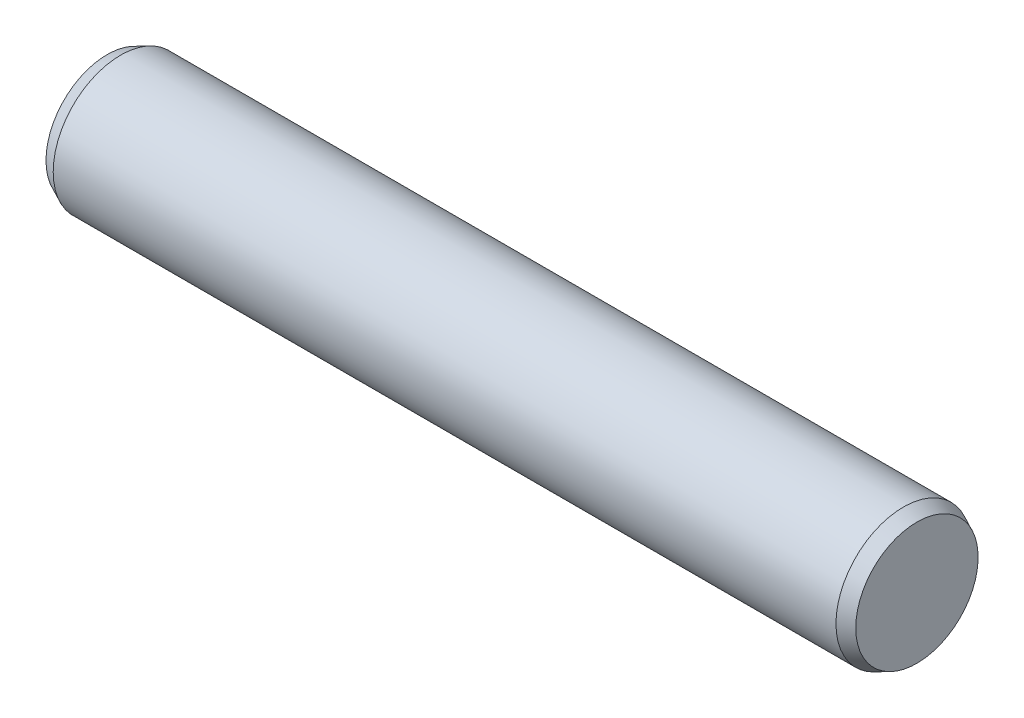
ISO-10303-21;
HEADER;
FILE_DESCRIPTION(('STEP AP214'),'2;1');
FILE_NAME('part.step','',(''),(''),'','','');
FILE_SCHEMA(('AUTOMOTIVE_DESIGN { 1 0 10303 214 1 1 1 1 }'));
ENDSEC;
DATA;
#1=APPLICATION_CONTEXT('core data for automotive mechanical design processes');
#2=APPLICATION_PROTOCOL_DEFINITION('international standard','automotive_design',2000,#1);
#3=PRODUCT_CONTEXT('',#1,'mechanical');
#4=PRODUCT('Part','Part','',(#3));
#5=PRODUCT_RELATED_PRODUCT_CATEGORY('part','',(#4));
#6=PRODUCT_DEFINITION_FORMATION('','',#4);
#7=PRODUCT_DEFINITION_CONTEXT('part definition',#1,'design');
#8=PRODUCT_DEFINITION('design','',#6,#7);
#9=PRODUCT_DEFINITION_SHAPE('','',#8);
#10=(LENGTH_UNIT() NAMED_UNIT(*) SI_UNIT(.MILLI.,.METRE.));
#11=(NAMED_UNIT(*) PLANE_ANGLE_UNIT() SI_UNIT($,.RADIAN.));
#12=(NAMED_UNIT(*) SI_UNIT($,.STERADIAN.) SOLID_ANGLE_UNIT());
#13=UNCERTAINTY_MEASURE_WITH_UNIT(LENGTH_MEASURE(1.E-05),#10,'distance_accuracy_value','');
#14=(GEOMETRIC_REPRESENTATION_CONTEXT(3) GLOBAL_UNCERTAINTY_ASSIGNED_CONTEXT((#13)) GLOBAL_UNIT_ASSIGNED_CONTEXT((#10,
#11,#12)) REPRESENTATION_CONTEXT('',''));
#15=CARTESIAN_POINT('',(0.,0.,0.));
#16=DIRECTION('',(0.,0.,1.));
#17=DIRECTION('',(1.,0.,0.));
#18=AXIS2_PLACEMENT_3D('',#15,#16,#17);
#19=CARTESIAN_POINT('',(0.,2.87889463707154,0.));
#20=DIRECTION('',(1.,0.,0.));
#21=DIRECTION('',(0.,0.,-1.));
#22=AXIS2_PLACEMENT_3D('',#19,#20,#21);
#23=PLANE('',#22);
#24=CARTESIAN_POINT('',(0.,0.,0.));
#25=DIRECTION('',(-1.,0.,0.));
#26=DIRECTION('',(0.,0.,1.));
#27=AXIS2_PLACEMENT_3D('',#24,#25,#26);
#28=CIRCLE('',#27,2.87889463707154);
#29=CARTESIAN_POINT('',(0.,0.,2.87889463707154));
#30=VERTEX_POINT('',#29);
#31=EDGE_CURVE('E44',#30,#30,#28,.T.);
#32=ORIENTED_EDGE('',*,*,#31,.T.);
#33=EDGE_LOOP('',(#32));
#34=FACE_BOUND('',#33,.T.);
#35=ADVANCED_FACE('F30',(#34),#23,.F.);
#36=CARTESIAN_POINT('',(38.1,0.,0.));
#37=DIRECTION('',(-1.,0.,0.));
#38=DIRECTION('',(0.,0.,1.));
#39=AXIS2_PLACEMENT_3D('',#36,#37,#38);
#40=PLANE('',#39);
#41=CARTESIAN_POINT('',(38.1,0.,0.));
#42=DIRECTION('',(-1.,0.,0.));
#43=DIRECTION('',(0.,0.,1.));
#44=AXIS2_PLACEMENT_3D('',#41,#42,#43);
#45=CIRCLE('',#44,2.87889463707155);
#46=CARTESIAN_POINT('',(38.1,0.,2.87889463707155));
#47=VERTEX_POINT('',#46);
#48=EDGE_CURVE('E10',#47,#47,#45,.T.);
#49=ORIENTED_EDGE('',*,*,#48,.F.);
#50=EDGE_LOOP('',(#49));
#51=FACE_BOUND('',#50,.T.);
#52=ADVANCED_FACE('F64',(#51),#40,.F.);
#53=CARTESIAN_POINT('',(38.1,0.,0.));
#54=DIRECTION('',(-1.,0.,0.));
#55=DIRECTION('',(0.,0.,1.));
#56=AXIS2_PLACEMENT_3D('',#53,#54,#55);
#57=CONICAL_SURFACE('',#56,2.87889463707155,0.436332312998584);
#58=CARTESIAN_POINT('',(37.465,0.,0.));
#59=DIRECTION('',(-1.,0.,0.));
#60=DIRECTION('',(0.,0.,1.));
#61=AXIS2_PLACEMENT_3D('',#58,#59,#60);
#62=CIRCLE('',#61,3.17499999999998);
#63=CARTESIAN_POINT('',(37.465,0.,3.17499999999998));
#64=VERTEX_POINT('',#63);
#65=EDGE_CURVE('E36',#64,#64,#62,.T.);
#66=ORIENTED_EDGE('',*,*,#65,.F.);
#67=EDGE_LOOP('',(#66));
#68=FACE_BOUND('',#67,.T.);
#69=ORIENTED_EDGE('',*,*,#48,.T.);
#70=EDGE_LOOP('',(#69));
#71=FACE_BOUND('',#70,.T.);
#72=ADVANCED_FACE('F59',(#68,#71),#57,.T.);
#73=CARTESIAN_POINT('',(-6.35,0.,0.));
#74=DIRECTION('',(-1.,0.,0.));
#75=DIRECTION('',(0.,0.,1.));
#76=AXIS2_PLACEMENT_3D('',#73,#74,#75);
#77=CYLINDRICAL_SURFACE('',#76,3.17499999999998);
#78=CARTESIAN_POINT('',(0.635,0.,0.));
#79=DIRECTION('',(-1.,0.,0.));
#80=DIRECTION('',(0.,0.,1.));
#81=AXIS2_PLACEMENT_3D('',#78,#79,#80);
#82=CIRCLE('',#81,3.17499999999997);
#83=CARTESIAN_POINT('',(0.635,0.,3.17499999999997));
#84=VERTEX_POINT('',#83);
#85=EDGE_CURVE('E40',#84,#84,#82,.T.);
#86=ORIENTED_EDGE('',*,*,#85,.F.);
#87=EDGE_LOOP('',(#86));
#88=FACE_BOUND('',#87,.T.);
#89=ORIENTED_EDGE('',*,*,#65,.T.);
#90=EDGE_LOOP('',(#89));
#91=FACE_BOUND('',#90,.T.);
#92=ADVANCED_FACE('F54',(#88,#91),#77,.T.);
#93=CARTESIAN_POINT('',(0.635,0.,0.));
#94=DIRECTION('',(1.,0.,0.));
#95=DIRECTION('',(0.,0.,-1.));
#96=AXIS2_PLACEMENT_3D('',#93,#94,#95);
#97=CONICAL_SURFACE('',#96,3.17499999999997,0.436332312998585);
#98=ORIENTED_EDGE('',*,*,#31,.F.);
#99=EDGE_LOOP('',(#98));
#100=FACE_BOUND('',#99,.T.);
#101=ORIENTED_EDGE('',*,*,#85,.T.);
#102=EDGE_LOOP('',(#101));
#103=FACE_BOUND('',#102,.T.);
#104=ADVANCED_FACE('F51',(#100,#103),#97,.T.);
#105=CLOSED_SHELL('',(#35,#52,#72,#92,#104));
#106=MANIFOLD_SOLID_BREP('B2',#105);
#107=ADVANCED_BREP_SHAPE_REPRESENTATION('',(#18,#106),#14);
#108=SHAPE_DEFINITION_REPRESENTATION(#9,#107);
ENDSEC;
END-ISO-10303-21;
